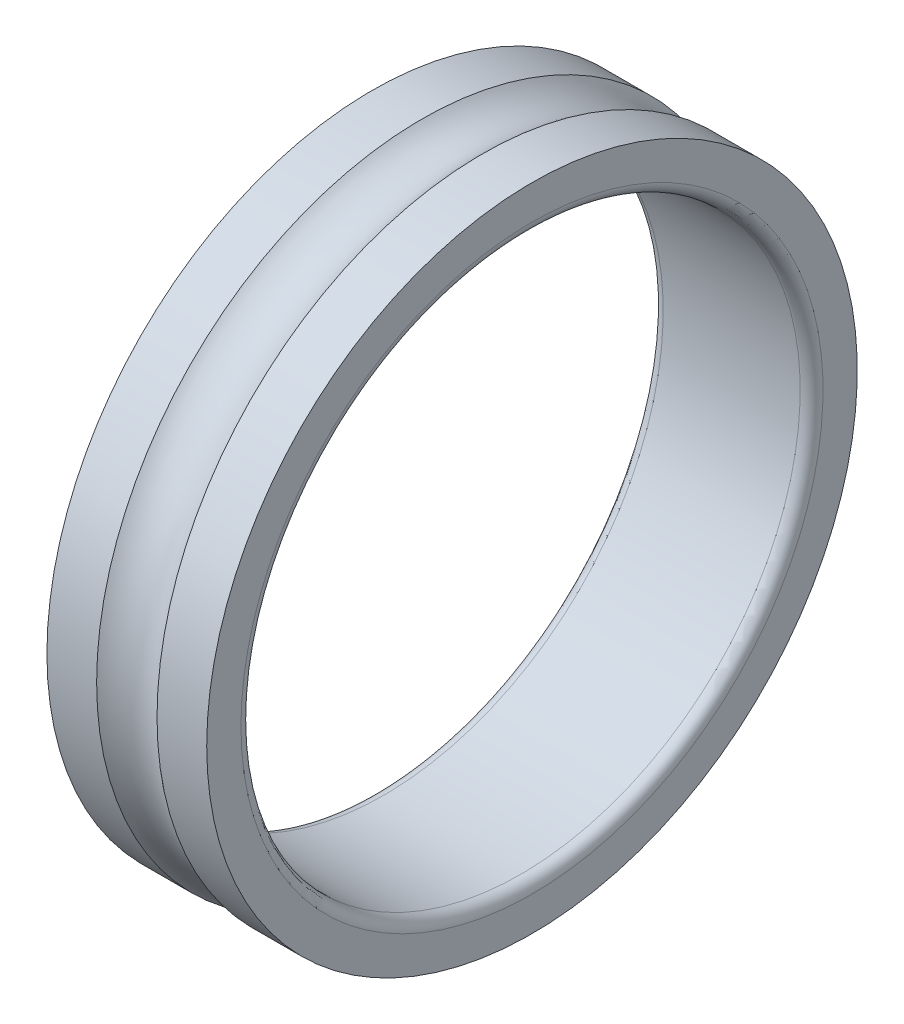
ISO-10303-21;
HEADER;
FILE_DESCRIPTION(('STEP AP214'),'2;1');
FILE_NAME('part.step','',(''),(''),'','','');
FILE_SCHEMA(('AUTOMOTIVE_DESIGN { 1 0 10303 214 1 1 1 1 }'));
ENDSEC;
DATA;
#1=APPLICATION_CONTEXT('core data for automotive mechanical design processes');
#2=APPLICATION_PROTOCOL_DEFINITION('international standard','automotive_design',2000,#1);
#3=PRODUCT_CONTEXT('',#1,'mechanical');
#4=PRODUCT('Part','Part','',(#3));
#5=PRODUCT_RELATED_PRODUCT_CATEGORY('part','',(#4));
#6=PRODUCT_DEFINITION_FORMATION('','',#4);
#7=PRODUCT_DEFINITION_CONTEXT('part definition',#1,'design');
#8=PRODUCT_DEFINITION('design','',#6,#7);
#9=PRODUCT_DEFINITION_SHAPE('','',#8);
#10=(LENGTH_UNIT() NAMED_UNIT(*) SI_UNIT(.MILLI.,.METRE.));
#11=(NAMED_UNIT(*) PLANE_ANGLE_UNIT() SI_UNIT($,.RADIAN.));
#12=(NAMED_UNIT(*) SI_UNIT($,.STERADIAN.) SOLID_ANGLE_UNIT());
#13=UNCERTAINTY_MEASURE_WITH_UNIT(LENGTH_MEASURE(1.E-05),#10,'distance_accuracy_value','');
#14=(GEOMETRIC_REPRESENTATION_CONTEXT(3) GLOBAL_UNCERTAINTY_ASSIGNED_CONTEXT((#13)) GLOBAL_UNIT_ASSIGNED_CONTEXT((#10,
#11,#12)) REPRESENTATION_CONTEXT('',''));
#15=CARTESIAN_POINT('',(0.,0.,0.));
#16=DIRECTION('',(0.,0.,1.));
#17=DIRECTION('',(1.,0.,0.));
#18=AXIS2_PLACEMENT_3D('',#15,#16,#17);
#19=CARTESIAN_POINT('',(0.,0.,0.));
#20=DIRECTION('',(-1.,0.,0.));
#21=DIRECTION('',(0.,0.,1.));
#22=AXIS2_PLACEMENT_3D('',#19,#20,#21);
#23=CYLINDRICAL_SURFACE('',#22,20.3571428571429);
#24=CARTESIAN_POINT('',(1.88982236504614,0.,0.));
#25=DIRECTION('',(-1.,0.,0.));
#26=DIRECTION('',(0.,0.,1.));
#27=AXIS2_PLACEMENT_3D('',#24,#25,#26);
#28=CIRCLE('',#27,20.3571428571429);
#29=CARTESIAN_POINT('',(1.88982236504614,0.,20.3571428571429));
#30=VERTEX_POINT('',#29);
#31=EDGE_CURVE('E376',#30,#30,#28,.T.);
#32=ORIENTED_EDGE('',*,*,#31,.F.);
#33=EDGE_LOOP('',(#32));
#34=FACE_BOUND('',#33,.T.);
#35=CARTESIAN_POINT('',(5.,0.,0.));
#36=DIRECTION('',(-1.,0.,0.));
#37=DIRECTION('',(0.,0.,1.));
#38=AXIS2_PLACEMENT_3D('',#35,#36,#37);
#39=CIRCLE('',#38,20.3571428571429);
#40=CARTESIAN_POINT('',(5.,0.,20.3571428571429));
#41=VERTEX_POINT('',#40);
#42=EDGE_CURVE('E10',#41,#41,#39,.T.);
#43=ORIENTED_EDGE('',*,*,#42,.T.);
#44=EDGE_LOOP('',(#43));
#45=FACE_BOUND('',#44,.T.);
#46=ADVANCED_FACE('F348',(#34,#45),#23,.T.);
#47=CARTESIAN_POINT('',(5.,18.2142857142857,0.));
#48=DIRECTION('',(-1.,0.,0.));
#49=DIRECTION('',(0.,0.,1.));
#50=AXIS2_PLACEMENT_3D('',#47,#48,#49);
#51=PLANE('',#50);
#52=ORIENTED_EDGE('',*,*,#42,.F.);
#53=EDGE_LOOP('',(#52));
#54=FACE_BOUND('',#53,.T.);
#55=CARTESIAN_POINT('',(5.,0.,0.));
#56=DIRECTION('',(-1.,0.,0.));
#57=DIRECTION('',(0.,0.,1.));
#58=AXIS2_PLACEMENT_3D('',#55,#56,#57);
#59=CIRCLE('',#58,18.2142857142857);
#60=CARTESIAN_POINT('',(5.,0.,18.2142857142857));
#61=VERTEX_POINT('',#60);
#62=EDGE_CURVE('E354',#61,#61,#59,.T.);
#63=ORIENTED_EDGE('',*,*,#62,.T.);
#64=EDGE_LOOP('',(#63));
#65=FACE_BOUND('',#64,.T.);
#66=ADVANCED_FACE('F383',(#54,#65),#51,.F.);
#67=CARTESIAN_POINT('',(4.28571428571429,0.,0.));
#68=DIRECTION('',(-1.,0.,0.));
#69=DIRECTION('',(0.,0.,1.));
#70=AXIS2_PLACEMENT_3D('',#67,#68,#69);
#71=TOROIDAL_SURFACE('',#70,18.2142857142857,0.714285714285715);
#72=ORIENTED_EDGE('',*,*,#62,.F.);
#73=EDGE_LOOP('',(#72));
#74=FACE_BOUND('',#73,.T.);
#75=CARTESIAN_POINT('',(4.28571428571429,0.,0.));
#76=DIRECTION('',(-1.,0.,0.));
#77=DIRECTION('',(0.,0.,1.));
#78=AXIS2_PLACEMENT_3D('',#75,#76,#77);
#79=CIRCLE('',#78,17.5);
#80=CARTESIAN_POINT('',(4.28571428571429,0.,17.5));
#81=VERTEX_POINT('',#80);
#82=EDGE_CURVE('E358',#81,#81,#79,.T.);
#83=ORIENTED_EDGE('',*,*,#82,.T.);
#84=EDGE_LOOP('',(#83));
#85=FACE_BOUND('',#84,.T.);
#86=ADVANCED_FACE('F387',(#74,#85),#71,.T.);
#87=CARTESIAN_POINT('',(0.,0.,0.));
#88=DIRECTION('',(-1.,0.,0.));
#89=DIRECTION('',(0.,0.,1.));
#90=AXIS2_PLACEMENT_3D('',#87,#88,#89);
#91=CYLINDRICAL_SURFACE('',#90,17.5);
#92=ORIENTED_EDGE('',*,*,#82,.F.);
#93=EDGE_LOOP('',(#92));
#94=FACE_BOUND('',#93,.T.);
#95=CARTESIAN_POINT('',(-4.28571428571429,0.,0.));
#96=DIRECTION('',(-1.,0.,0.));
#97=DIRECTION('',(0.,0.,1.));
#98=AXIS2_PLACEMENT_3D('',#95,#96,#97);
#99=CIRCLE('',#98,17.5);
#100=CARTESIAN_POINT('',(-4.28571428571429,0.,17.5));
#101=VERTEX_POINT('',#100);
#102=EDGE_CURVE('E362',#101,#101,#99,.T.);
#103=ORIENTED_EDGE('',*,*,#102,.T.);
#104=EDGE_LOOP('',(#103));
#105=FACE_BOUND('',#104,.T.);
#106=ADVANCED_FACE('F392',(#94,#105),#91,.F.);
#107=CARTESIAN_POINT('',(-4.28571428571429,0.,0.));
#108=DIRECTION('',(-1.,0.,0.));
#109=DIRECTION('',(0.,0.,1.));
#110=AXIS2_PLACEMENT_3D('',#107,#108,#109);
#111=TOROIDAL_SURFACE('',#110,18.2142857142857,0.714285714285715);
#112=ORIENTED_EDGE('',*,*,#102,.F.);
#113=EDGE_LOOP('',(#112));
#114=FACE_BOUND('',#113,.T.);
#115=CARTESIAN_POINT('',(-5.,0.,0.));
#116=DIRECTION('',(-1.,0.,0.));
#117=DIRECTION('',(0.,0.,1.));
#118=AXIS2_PLACEMENT_3D('',#115,#116,#117);
#119=CIRCLE('',#118,18.2142857142857);
#120=CARTESIAN_POINT('',(-5.,0.,18.2142857142857));
#121=VERTEX_POINT('',#120);
#122=EDGE_CURVE('E367',#121,#121,#119,.T.);
#123=ORIENTED_EDGE('',*,*,#122,.T.);
#124=EDGE_LOOP('',(#123));
#125=FACE_BOUND('',#124,.T.);
#126=ADVANCED_FACE('F398',(#114,#125),#111,.T.);
#127=CARTESIAN_POINT('',(-5.,18.2142857142857,0.));
#128=DIRECTION('',(1.,0.,0.));
#129=DIRECTION('',(0.,0.,-1.));
#130=AXIS2_PLACEMENT_3D('',#127,#128,#129);
#131=PLANE('',#130);
#132=ORIENTED_EDGE('',*,*,#122,.F.);
#133=EDGE_LOOP('',(#132));
#134=FACE_BOUND('',#133,.T.);
#135=CARTESIAN_POINT('',(-5.,0.,0.));
#136=DIRECTION('',(-1.,0.,0.));
#137=DIRECTION('',(0.,0.,1.));
#138=AXIS2_PLACEMENT_3D('',#135,#136,#137);
#139=CIRCLE('',#138,20.3571428571429);
#140=CARTESIAN_POINT('',(-5.,0.,20.3571428571429));
#141=VERTEX_POINT('',#140);
#142=EDGE_CURVE('E370',#141,#141,#139,.T.);
#143=ORIENTED_EDGE('',*,*,#142,.T.);
#144=EDGE_LOOP('',(#143));
#145=FACE_BOUND('',#144,.T.);
#146=ADVANCED_FACE('F402',(#134,#145),#131,.F.);
#147=CARTESIAN_POINT('',(0.,0.,0.));
#148=DIRECTION('',(-1.,0.,0.));
#149=DIRECTION('',(0.,0.,1.));
#150=AXIS2_PLACEMENT_3D('',#147,#148,#149);
#151=CYLINDRICAL_SURFACE('',#150,20.3571428571429);
#152=ORIENTED_EDGE('',*,*,#142,.F.);
#153=EDGE_LOOP('',(#152));
#154=FACE_BOUND('',#153,.T.);
#155=CARTESIAN_POINT('',(-1.88982236504614,0.,0.));
#156=DIRECTION('',(-1.,0.,0.));
#157=DIRECTION('',(0.,0.,1.));
#158=AXIS2_PLACEMENT_3D('',#155,#156,#157);
#159=CIRCLE('',#158,20.3571428571429);
#160=CARTESIAN_POINT('',(-1.88982236504614,0.,20.3571428571429));
#161=VERTEX_POINT('',#160);
#162=EDGE_CURVE('E373',#161,#161,#159,.T.);
#163=ORIENTED_EDGE('',*,*,#162,.T.);
#164=EDGE_LOOP('',(#163));
#165=FACE_BOUND('',#164,.T.);
#166=ADVANCED_FACE('F406',(#154,#165),#151,.T.);
#167=CARTESIAN_POINT('',(0.,0.,0.));
#168=DIRECTION('',(-1.,0.,0.));
#169=DIRECTION('',(0.,0.,1.));
#170=AXIS2_PLACEMENT_3D('',#167,#168,#169);
#171=TOROIDAL_SURFACE('',#170,22.5,2.85714285714286);
#172=ORIENTED_EDGE('',*,*,#162,.F.);
#173=EDGE_LOOP('',(#172));
#174=FACE_BOUND('',#173,.T.);
#175=ORIENTED_EDGE('',*,*,#31,.T.);
#176=EDGE_LOOP('',(#175));
#177=FACE_BOUND('',#176,.T.);
#178=ADVANCED_FACE('F380',(#174,#177),#171,.F.);
#179=CLOSED_SHELL('',(#46,#66,#86,#106,#126,#146,#166,#178));
#180=MANIFOLD_SOLID_BREP('B2',#179);
#181=ADVANCED_BREP_SHAPE_REPRESENTATION('',(#18,#180),#14);
#182=SHAPE_DEFINITION_REPRESENTATION(#9,#181);
ENDSEC;
END-ISO-10303-21;
